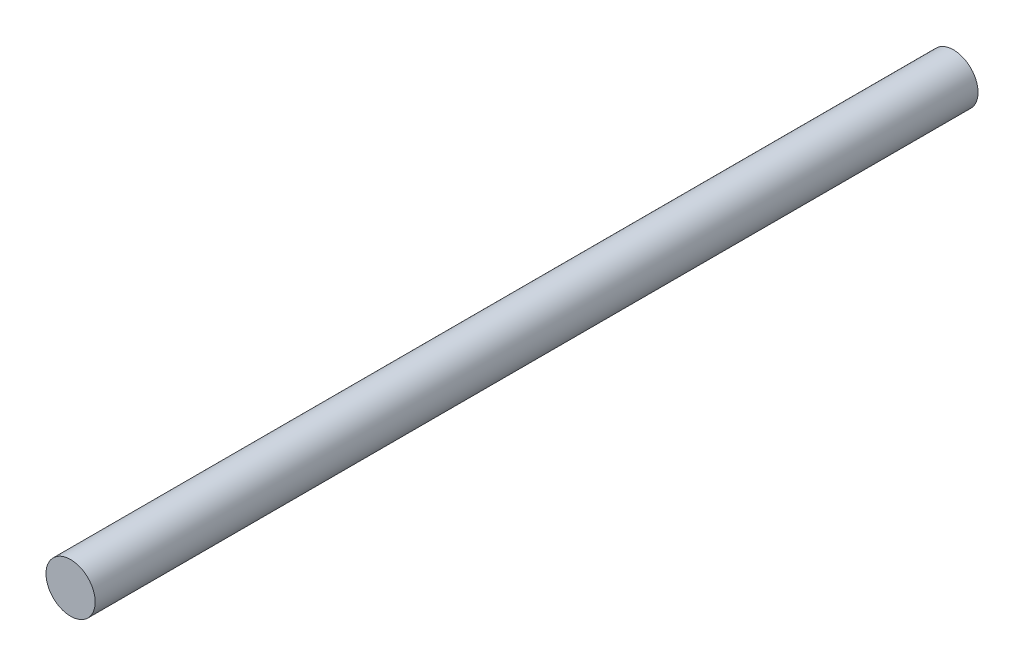
ISO-10303-21;
HEADER;
FILE_DESCRIPTION(('STEP AP214'),'2;1');
FILE_NAME('part.step','',(''),(''),'','','');
FILE_SCHEMA(('AUTOMOTIVE_DESIGN { 1 0 10303 214 1 1 1 1 }'));
ENDSEC;
DATA;
#1=APPLICATION_CONTEXT('core data for automotive mechanical design processes');
#2=APPLICATION_PROTOCOL_DEFINITION('international standard','automotive_design',2000,#1);
#3=PRODUCT_CONTEXT('',#1,'mechanical');
#4=PRODUCT('Part','Part','',(#3));
#5=PRODUCT_RELATED_PRODUCT_CATEGORY('part','',(#4));
#6=PRODUCT_DEFINITION_FORMATION('','',#4);
#7=PRODUCT_DEFINITION_CONTEXT('part definition',#1,'design');
#8=PRODUCT_DEFINITION('design','',#6,#7);
#9=PRODUCT_DEFINITION_SHAPE('','',#8);
#10=(LENGTH_UNIT() NAMED_UNIT(*) SI_UNIT(.MILLI.,.METRE.));
#11=(NAMED_UNIT(*) PLANE_ANGLE_UNIT() SI_UNIT($,.RADIAN.));
#12=(NAMED_UNIT(*) SI_UNIT($,.STERADIAN.) SOLID_ANGLE_UNIT());
#13=UNCERTAINTY_MEASURE_WITH_UNIT(LENGTH_MEASURE(1.E-05),#10,'distance_accuracy_value','');
#14=(GEOMETRIC_REPRESENTATION_CONTEXT(3) GLOBAL_UNCERTAINTY_ASSIGNED_CONTEXT((#13)) GLOBAL_UNIT_ASSIGNED_CONTEXT((#10,
#11,#12)) REPRESENTATION_CONTEXT('',''));
#15=CARTESIAN_POINT('',(0.,0.,0.));
#16=DIRECTION('',(0.,0.,1.));
#17=DIRECTION('',(1.,0.,0.));
#18=AXIS2_PLACEMENT_3D('',#15,#16,#17);
#19=CARTESIAN_POINT('',(0.,0.,57.));
#20=DIRECTION('',(0.,0.,-1.));
#21=DIRECTION('',(-1.,0.,0.));
#22=AXIS2_PLACEMENT_3D('',#19,#20,#21);
#23=CYLINDRICAL_SURFACE('',#22,1.5875);
#24=CARTESIAN_POINT('',(0.,0.,57.));
#25=DIRECTION('',(0.,0.,1.));
#26=DIRECTION('',(1.,0.,0.));
#27=AXIS2_PLACEMENT_3D('',#24,#25,#26);
#28=CIRCLE('',#27,1.5875);
#29=CARTESIAN_POINT('',(-1.5875,0.,57.));
#30=VERTEX_POINT('',#29);
#31=EDGE_CURVE('E10',#30,#30,#28,.T.);
#32=CARTESIAN_POINT('',(0.,0.,0.));
#33=DIRECTION('',(0.,0.,1.));
#34=DIRECTION('',(1.,0.,0.));
#35=AXIS2_PLACEMENT_3D('',#32,#33,#34);
#36=CIRCLE('',#35,1.5875);
#37=CARTESIAN_POINT('',(-1.5875,0.,0.));
#38=VERTEX_POINT('',#37);
#39=EDGE_CURVE('E33',#38,#38,#36,.T.);
#40=CARTESIAN_POINT('',(-1.5875,0.,57.));
#41=CARTESIAN_POINT('',(-1.5875,0.,56.40625));
#42=CARTESIAN_POINT('',(-1.5875,0.,55.8125));
#43=CARTESIAN_POINT('',(-1.5875,0.,54.625));
#44=CARTESIAN_POINT('',(-1.5875,0.,54.03125));
#45=CARTESIAN_POINT('',(-1.5875,0.,52.84375));
#46=CARTESIAN_POINT('',(-1.5875,0.,52.25));
#47=CARTESIAN_POINT('',(-1.5875,0.,51.0625));
#48=CARTESIAN_POINT('',(-1.5875,0.,50.46875));
#49=CARTESIAN_POINT('',(-1.5875,0.,49.28125));
#50=CARTESIAN_POINT('',(-1.5875,0.,48.6875));
#51=CARTESIAN_POINT('',(-1.5875,0.,47.5));
#52=CARTESIAN_POINT('',(-1.5875,0.,46.90625));
#53=CARTESIAN_POINT('',(-1.5875,0.,45.71875));
#54=CARTESIAN_POINT('',(-1.5875,0.,45.125));
#55=CARTESIAN_POINT('',(-1.5875,0.,43.9375));
#56=CARTESIAN_POINT('',(-1.5875,0.,43.34375));
#57=CARTESIAN_POINT('',(-1.5875,0.,42.15625));
#58=CARTESIAN_POINT('',(-1.5875,0.,41.5625));
#59=CARTESIAN_POINT('',(-1.5875,0.,40.375));
#60=CARTESIAN_POINT('',(-1.5875,0.,39.78125));
#61=CARTESIAN_POINT('',(-1.5875,0.,38.59375));
#62=CARTESIAN_POINT('',(-1.5875,0.,38.));
#63=CARTESIAN_POINT('',(-1.5875,0.,36.8125));
#64=CARTESIAN_POINT('',(-1.5875,0.,36.21875));
#65=CARTESIAN_POINT('',(-1.5875,0.,35.03125));
#66=CARTESIAN_POINT('',(-1.5875,0.,34.4375));
#67=CARTESIAN_POINT('',(-1.5875,0.,33.25));
#68=CARTESIAN_POINT('',(-1.5875,0.,32.65625));
#69=CARTESIAN_POINT('',(-1.5875,0.,31.46875));
#70=CARTESIAN_POINT('',(-1.5875,0.,30.875));
#71=CARTESIAN_POINT('',(-1.5875,0.,29.6875));
#72=CARTESIAN_POINT('',(-1.5875,0.,29.09375));
#73=CARTESIAN_POINT('',(-1.5875,0.,27.90625));
#74=CARTESIAN_POINT('',(-1.5875,0.,27.3125));
#75=CARTESIAN_POINT('',(-1.5875,0.,26.125));
#76=CARTESIAN_POINT('',(-1.5875,0.,25.53125));
#77=CARTESIAN_POINT('',(-1.5875,0.,24.34375));
#78=CARTESIAN_POINT('',(-1.5875,0.,23.75));
#79=CARTESIAN_POINT('',(-1.5875,0.,22.5625));
#80=CARTESIAN_POINT('',(-1.5875,0.,21.96875));
#81=CARTESIAN_POINT('',(-1.5875,0.,20.78125));
#82=CARTESIAN_POINT('',(-1.5875,0.,20.1875));
#83=CARTESIAN_POINT('',(-1.5875,0.,19.));
#84=CARTESIAN_POINT('',(-1.5875,0.,18.40625));
#85=CARTESIAN_POINT('',(-1.5875,0.,17.21875));
#86=CARTESIAN_POINT('',(-1.5875,0.,16.625));
#87=CARTESIAN_POINT('',(-1.5875,0.,15.4375));
#88=CARTESIAN_POINT('',(-1.5875,0.,14.84375));
#89=CARTESIAN_POINT('',(-1.5875,0.,13.65625));
#90=CARTESIAN_POINT('',(-1.5875,0.,13.0625));
#91=CARTESIAN_POINT('',(-1.5875,0.,11.875));
#92=CARTESIAN_POINT('',(-1.5875,0.,11.28125));
#93=CARTESIAN_POINT('',(-1.5875,0.,10.09375));
#94=CARTESIAN_POINT('',(-1.5875,0.,9.5));
#95=CARTESIAN_POINT('',(-1.5875,0.,8.3125));
#96=CARTESIAN_POINT('',(-1.5875,0.,7.71875));
#97=CARTESIAN_POINT('',(-1.5875,0.,6.53125));
#98=CARTESIAN_POINT('',(-1.5875,0.,5.9375));
#99=CARTESIAN_POINT('',(-1.5875,0.,4.75));
#100=CARTESIAN_POINT('',(-1.5875,0.,4.15625));
#101=CARTESIAN_POINT('',(-1.5875,0.,2.96875));
#102=CARTESIAN_POINT('',(-1.5875,0.,2.375));
#103=CARTESIAN_POINT('',(-1.5875,0.,1.1875));
#104=CARTESIAN_POINT('',(-1.5875,0.,0.593749999999999));
#105=CARTESIAN_POINT('',(-1.5875,0.,0.));
#106=B_SPLINE_CURVE_WITH_KNOTS('',3,(#40,#41,#42,#43,#44,#45,#46,#47,#48,#49,#50,#51,#52,#53,
#54,#55,#56,#57,#58,#59,#60,#61,#62,#63,#64,#65,#66,#67,#68,#69,#70,#71,#72,#73,#74,#75,#76,#77,
#78,#79,#80,#81,#82,#83,#84,#85,#86,#87,#88,#89,#90,#91,#92,#93,#94,#95,#96,#97,#98,#99,#100,
#101,#102,#103,#104,#105),.UNSPECIFIED.,.F.,.F.,(4,2,2,2,2,2,2,2,2,2,2,2,2,2,2,2,2,2,2,2,2,2,2,
2,2,2,2,2,2,2,2,2,4),(0.,1.78125000000001,3.5625,5.34375,7.12500000000001,8.90625,10.6875,
12.46875,14.25,16.03125,17.8125,19.59375,21.375,23.15625,24.9375,26.71875,28.5,30.28125,32.0625,
33.84375,35.625,37.40625,39.1875,40.96875,42.75,44.53125,46.3125,48.09375,49.875,51.65625,
53.4375,55.21875,57.),.UNSPECIFIED.);
#107=EDGE_CURVE('BSEAM30',#30,#38,#106,.T.);
#108=ORIENTED_EDGE('',*,*,#31,.F.);
#109=ORIENTED_EDGE('',*,*,#39,.T.);
#110=ORIENTED_EDGE('',*,*,#107,.T.);
#111=ORIENTED_EDGE('',*,*,#107,.F.);
#112=EDGE_LOOP('',(#108,#110,#109,#111));
#113=FACE_BOUND('',#112,.T.);
#114=ADVANCED_FACE('F30',(#113),#23,.T.);
#115=CARTESIAN_POINT('',(0.,0.,57.));
#116=DIRECTION('',(0.,0.,1.));
#117=DIRECTION('',(1.,0.,0.));
#118=AXIS2_PLACEMENT_3D('',#115,#116,#117);
#119=PLANE('',#118);
#120=ORIENTED_EDGE('',*,*,#31,.T.);
#121=EDGE_LOOP('',(#120));
#122=FACE_BOUND('',#121,.T.);
#123=ADVANCED_FACE('F45',(#122),#119,.T.);
#124=CARTESIAN_POINT('',(0.,0.,0.));
#125=DIRECTION('',(0.,0.,1.));
#126=DIRECTION('',(1.,0.,0.));
#127=AXIS2_PLACEMENT_3D('',#124,#125,#126);
#128=PLANE('',#127);
#129=ORIENTED_EDGE('',*,*,#39,.F.);
#130=EDGE_LOOP('',(#129));
#131=FACE_BOUND('',#130,.T.);
#132=ADVANCED_FACE('F43',(#131),#128,.F.);
#133=CLOSED_SHELL('',(#114,#123,#132));
#134=MANIFOLD_SOLID_BREP('B2',#133);
#135=ADVANCED_BREP_SHAPE_REPRESENTATION('',(#18,#134),#14);
#136=SHAPE_DEFINITION_REPRESENTATION(#9,#135);
ENDSEC;
END-ISO-10303-21;
